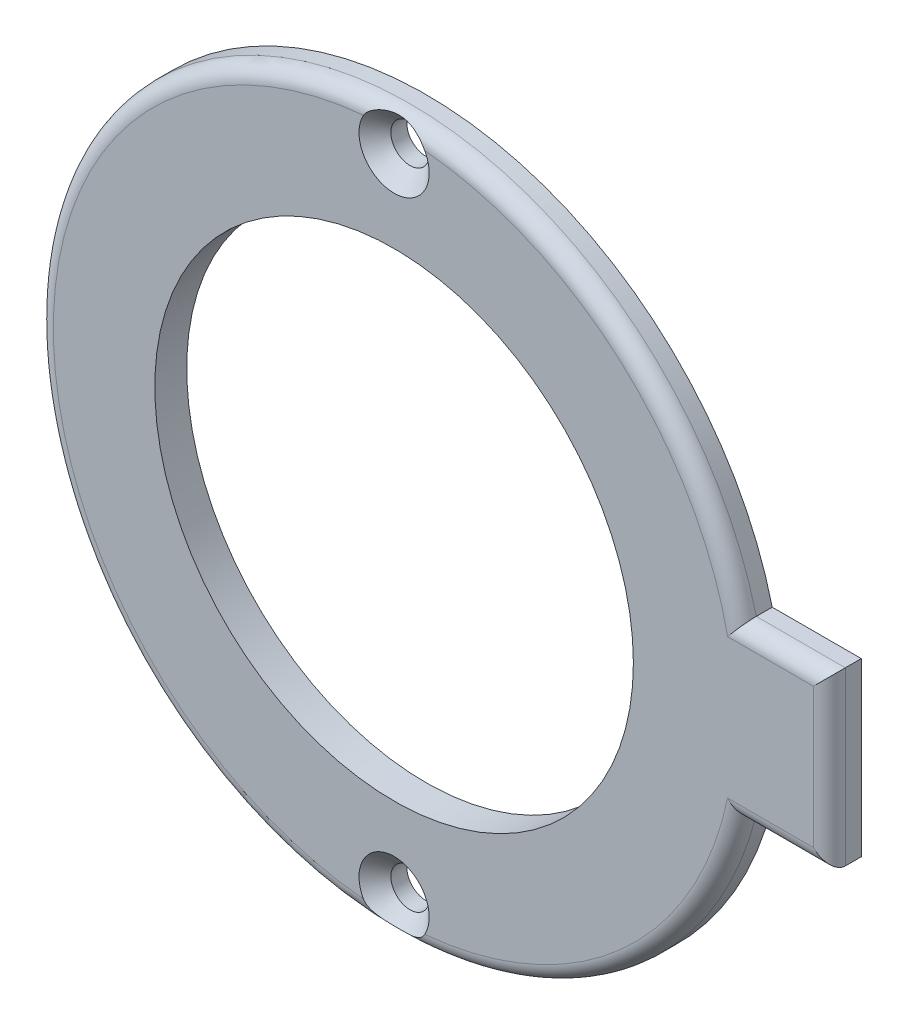
ISO-10303-21;
HEADER;
FILE_DESCRIPTION(('STEP AP214'),'2;1');
FILE_NAME('part.step','',(''),(''),'','','');
FILE_SCHEMA(('AUTOMOTIVE_DESIGN { 1 0 10303 214 1 1 1 1 }'));
ENDSEC;
DATA;
#1=APPLICATION_CONTEXT('core data for automotive mechanical design processes');
#2=APPLICATION_PROTOCOL_DEFINITION('international standard','automotive_design',2000,#1);
#3=PRODUCT_CONTEXT('',#1,'mechanical');
#4=PRODUCT('Part','Part','',(#3));
#5=PRODUCT_RELATED_PRODUCT_CATEGORY('part','',(#4));
#6=PRODUCT_DEFINITION_FORMATION('','',#4);
#7=PRODUCT_DEFINITION_CONTEXT('part definition',#1,'design');
#8=PRODUCT_DEFINITION('design','',#6,#7);
#9=PRODUCT_DEFINITION_SHAPE('','',#8);
#10=(LENGTH_UNIT() NAMED_UNIT(*) SI_UNIT(.MILLI.,.METRE.));
#11=(NAMED_UNIT(*) PLANE_ANGLE_UNIT() SI_UNIT($,.RADIAN.));
#12=(NAMED_UNIT(*) SI_UNIT($,.STERADIAN.) SOLID_ANGLE_UNIT());
#13=UNCERTAINTY_MEASURE_WITH_UNIT(LENGTH_MEASURE(1.E-05),#10,'distance_accuracy_value','');
#14=(GEOMETRIC_REPRESENTATION_CONTEXT(3) GLOBAL_UNCERTAINTY_ASSIGNED_CONTEXT((#13)) GLOBAL_UNIT_ASSIGNED_CONTEXT((#10,
#11,#12)) REPRESENTATION_CONTEXT('',''));
#15=CARTESIAN_POINT('',(0.,0.,0.));
#16=DIRECTION('',(0.,0.,1.));
#17=DIRECTION('',(1.,0.,0.));
#18=AXIS2_PLACEMENT_3D('',#15,#16,#17);
#19=CARTESIAN_POINT('',(0.,0.,2.));
#20=DIRECTION('',(0.,0.,-1.));
#21=DIRECTION('',(-1.,0.,0.));
#22=AXIS2_PLACEMENT_3D('',#19,#20,#21);
#23=PLANE('',#22);
#24=CARTESIAN_POINT('',(0.,0.,2.));
#25=DIRECTION('',(0.,0.,1.));
#26=DIRECTION('',(1.,0.,0.));
#27=AXIS2_PLACEMENT_3D('',#24,#25,#26);
#28=CIRCLE('',#27,15.);
#29=CARTESIAN_POINT('',(15.,0.,2.));
#30=VERTEX_POINT('',#29);
#31=EDGE_CURVE('E140',#30,#30,#28,.T.);
#32=ORIENTED_EDGE('',*,*,#31,.F.);
#33=EDGE_LOOP('',(#32));
#34=FACE_BOUND('',#33,.T.);
#35=CARTESIAN_POINT('',(0.,20.2,2.));
#36=DIRECTION('',(0.,0.,1.));
#37=DIRECTION('',(1.,0.,0.));
#38=AXIS2_PLACEMENT_3D('',#35,#36,#37);
#39=CIRCLE('',#38,2.2);
#40=CARTESIAN_POINT('',(-1.92030912127777,21.2735049504951,2.));
#41=VERTEX_POINT('',#40);
#42=CARTESIAN_POINT('',(1.92030912127777,21.2735049504951,2.));
#43=VERTEX_POINT('',#42);
#44=EDGE_CURVE('E375',#41,#43,#39,.T.);
#45=ORIENTED_EDGE('',*,*,#44,.F.);
#46=CARTESIAN_POINT('',(0.,0.,2.));
#47=DIRECTION('',(0.,0.,-1.));
#48=DIRECTION('',(-1.,0.,0.));
#49=AXIS2_PLACEMENT_3D('',#46,#47,#48);
#50=CIRCLE('',#49,21.36);
#51=CARTESIAN_POINT('',(-1.92030912127778,-21.273504950495,2.));
#52=VERTEX_POINT('',#51);
#53=EDGE_CURVE('E183',#41,#52,#50,.F.);
#54=ORIENTED_EDGE('',*,*,#53,.T.);
#55=CARTESIAN_POINT('',(0.,-20.2,2.));
#56=DIRECTION('',(0.,0.,1.));
#57=DIRECTION('',(1.,0.,0.));
#58=AXIS2_PLACEMENT_3D('',#55,#56,#57);
#59=CIRCLE('',#58,2.2);
#60=CARTESIAN_POINT('',(1.92030912127778,-21.273504950495,2.));
#61=VERTEX_POINT('',#60);
#62=EDGE_CURVE('E165',#61,#52,#59,.T.);
#63=ORIENTED_EDGE('',*,*,#62,.F.);
#64=CARTESIAN_POINT('',(0.,0.,2.));
#65=DIRECTION('',(0.,0.,-1.));
#66=DIRECTION('',(-1.,0.,0.));
#67=AXIS2_PLACEMENT_3D('',#64,#65,#66);
#68=CIRCLE('',#67,21.36);
#69=CARTESIAN_POINT('',(20.9061043716901,-4.38,2.));
#70=VERTEX_POINT('',#69);
#71=EDGE_CURVE('E119',#61,#70,#68,.F.);
#72=ORIENTED_EDGE('',*,*,#71,.T.);
#73=DIRECTION('',(1.,0.,0.));
#74=VECTOR('',#73,1.);
#75=CARTESIAN_POINT('',(0.,-4.38,2.));
#76=LINE('',#75,#74);
#77=CARTESIAN_POINT('',(26.283114983799,-4.38,2.));
#78=VERTEX_POINT('',#77);
#79=EDGE_CURVE('E169',#70,#78,#76,.T.);
#80=ORIENTED_EDGE('',*,*,#79,.T.);
#81=DIRECTION('',(0.,1.,0.));
#82=VECTOR('',#81,1.);
#83=CARTESIAN_POINT('',(26.283114983799,0.,2.));
#84=LINE('',#83,#82);
#85=CARTESIAN_POINT('',(26.283114983799,4.38,2.));
#86=VERTEX_POINT('',#85);
#87=EDGE_CURVE('E172',#78,#86,#84,.T.);
#88=ORIENTED_EDGE('',*,*,#87,.T.);
#89=DIRECTION('',(-1.,0.,0.));
#90=VECTOR('',#89,1.);
#91=CARTESIAN_POINT('',(0.,4.38,2.));
#92=LINE('',#91,#90);
#93=CARTESIAN_POINT('',(20.9061043716901,4.38,2.));
#94=VERTEX_POINT('',#93);
#95=EDGE_CURVE('E175',#86,#94,#92,.T.);
#96=ORIENTED_EDGE('',*,*,#95,.T.);
#97=CARTESIAN_POINT('',(0.,0.,2.));
#98=DIRECTION('',(0.,0.,-1.));
#99=DIRECTION('',(-1.,0.,0.));
#100=AXIS2_PLACEMENT_3D('',#97,#98,#99);
#101=CIRCLE('',#100,21.36);
#102=EDGE_CURVE('E179',#94,#43,#101,.F.);
#103=ORIENTED_EDGE('',*,*,#102,.T.);
#104=EDGE_LOOP('',(#45,#54,#63,#72,#80,#88,#96,#103));
#105=FACE_BOUND('',#104,.T.);
#106=ADVANCED_FACE('F39',(#34,#105),#23,.F.);
#107=CARTESIAN_POINT('',(0.,0.,2.));
#108=DIRECTION('',(0.,0.,-1.));
#109=DIRECTION('',(-1.,0.,0.));
#110=AXIS2_PLACEMENT_3D('',#107,#108,#109);
#111=CYLINDRICAL_SURFACE('',#110,22.36);
#112=CARTESIAN_POINT('',(0.,0.,1.));
#113=DIRECTION('',(0.,0.,-1.));
#114=DIRECTION('',(-1.,0.,0.));
#115=AXIS2_PLACEMENT_3D('',#112,#113,#114);
#116=CIRCLE('',#115,22.36);
#117=CARTESIAN_POINT('',(21.703114983799,-5.38,1.));
#118=VERTEX_POINT('',#117);
#119=CARTESIAN_POINT('',(21.703114983799,5.38,1.));
#120=VERTEX_POINT('',#119);
#121=EDGE_CURVE('E54',#118,#120,#116,.T.);
#122=ORIENTED_EDGE('',*,*,#121,.T.);
#123=DIRECTION('',(0.,0.,-1.));
#124=VECTOR('',#123,1.);
#125=CARTESIAN_POINT('',(21.703114983799,5.38,2.));
#126=LINE('',#125,#124);
#127=CARTESIAN_POINT('',(21.703114983799,5.38,0.));
#128=VERTEX_POINT('',#127);
#129=EDGE_CURVE('E133',#120,#128,#126,.T.);
#130=ORIENTED_EDGE('',*,*,#129,.T.);
#131=CARTESIAN_POINT('',(0.,0.,0.));
#132=DIRECTION('',(0.,0.,1.));
#133=DIRECTION('',(-1.,0.,0.));
#134=AXIS2_PLACEMENT_3D('',#131,#132,#133);
#135=CIRCLE('',#134,22.36);
#136=CARTESIAN_POINT('',(21.703114983799,-5.38,0.));
#137=VERTEX_POINT('',#136);
#138=EDGE_CURVE('E126',#128,#137,#135,.T.);
#139=ORIENTED_EDGE('',*,*,#138,.T.);
#140=DIRECTION('',(0.,0.,-1.));
#141=VECTOR('',#140,1.);
#142=CARTESIAN_POINT('',(21.703114983799,-5.38,2.));
#143=LINE('',#142,#141);
#144=EDGE_CURVE('E110',#118,#137,#143,.T.);
#145=ORIENTED_EDGE('',*,*,#144,.F.);
#146=EDGE_LOOP('',(#122,#130,#139,#145));
#147=FACE_BOUND('',#146,.T.);
#148=ADVANCED_FACE('F131',(#147),#111,.T.);
#149=CARTESIAN_POINT('',(21.703114983799,-5.38,2.));
#150=DIRECTION('',(0.,1.,0.));
#151=DIRECTION('',(-1.,0.,0.));
#152=AXIS2_PLACEMENT_3D('',#149,#150,#151);
#153=PLANE('',#152);
#154=DIRECTION('',(0.,0.,-1.));
#155=VECTOR('',#154,1.);
#156=CARTESIAN_POINT('',(27.283114983799,-5.38,2.));
#157=LINE('',#156,#155);
#158=CARTESIAN_POINT('',(27.283114983799,-5.38,1.));
#159=VERTEX_POINT('',#158);
#160=CARTESIAN_POINT('',(27.283114983799,-5.38,0.));
#161=VERTEX_POINT('',#160);
#162=EDGE_CURVE('E120',#159,#161,#157,.T.);
#163=ORIENTED_EDGE('',*,*,#162,.F.);
#164=DIRECTION('',(1.,0.,0.));
#165=VECTOR('',#164,1.);
#166=CARTESIAN_POINT('',(21.703114983799,-5.38,1.));
#167=LINE('',#166,#165);
#168=EDGE_CURVE('E62',#159,#118,#167,.F.);
#169=ORIENTED_EDGE('',*,*,#168,.T.);
#170=ORIENTED_EDGE('',*,*,#144,.T.);
#171=DIRECTION('',(1.,0.,0.));
#172=VECTOR('',#171,1.);
#173=CARTESIAN_POINT('',(21.703114983799,-5.38,0.));
#174=LINE('',#173,#172);
#175=EDGE_CURVE('E113',#137,#161,#174,.T.);
#176=ORIENTED_EDGE('',*,*,#175,.T.);
#177=EDGE_LOOP('',(#163,#169,#170,#176));
#178=FACE_BOUND('',#177,.T.);
#179=ADVANCED_FACE('F112',(#178),#153,.F.);
#180=CARTESIAN_POINT('',(27.283114983799,-5.38,2.));
#181=DIRECTION('',(-1.,0.,0.));
#182=DIRECTION('',(0.,0.,1.));
#183=AXIS2_PLACEMENT_3D('',#180,#181,#182);
#184=PLANE('',#183);
#185=DIRECTION('',(0.,0.,-1.));
#186=VECTOR('',#185,1.);
#187=CARTESIAN_POINT('',(27.283114983799,5.38,2.));
#188=LINE('',#187,#186);
#189=CARTESIAN_POINT('',(27.283114983799,5.38,1.));
#190=VERTEX_POINT('',#189);
#191=CARTESIAN_POINT('',(27.283114983799,5.38,0.));
#192=VERTEX_POINT('',#191);
#193=EDGE_CURVE('E151',#190,#192,#188,.T.);
#194=ORIENTED_EDGE('',*,*,#193,.F.);
#195=DIRECTION('',(0.,1.,0.));
#196=VECTOR('',#195,1.);
#197=CARTESIAN_POINT('',(27.283114983799,-5.38,1.));
#198=LINE('',#197,#196);
#199=EDGE_CURVE('E70',#190,#159,#198,.F.);
#200=ORIENTED_EDGE('',*,*,#199,.T.);
#201=ORIENTED_EDGE('',*,*,#162,.T.);
#202=DIRECTION('',(0.,1.,0.));
#203=VECTOR('',#202,1.);
#204=CARTESIAN_POINT('',(27.283114983799,-5.38,0.));
#205=LINE('',#204,#203);
#206=EDGE_CURVE('E128',#161,#192,#205,.T.);
#207=ORIENTED_EDGE('',*,*,#206,.T.);
#208=EDGE_LOOP('',(#194,#200,#201,#207));
#209=FACE_BOUND('',#208,.T.);
#210=ADVANCED_FACE('F268',(#209),#184,.F.);
#211=CARTESIAN_POINT('',(27.283114983799,5.38,2.));
#212=DIRECTION('',(0.,-1.,0.));
#213=DIRECTION('',(0.,0.,-1.));
#214=AXIS2_PLACEMENT_3D('',#211,#212,#213);
#215=PLANE('',#214);
#216=ORIENTED_EDGE('',*,*,#129,.F.);
#217=DIRECTION('',(-1.,0.,0.));
#218=VECTOR('',#217,1.);
#219=CARTESIAN_POINT('',(27.283114983799,5.38,1.));
#220=LINE('',#219,#218);
#221=EDGE_CURVE('E187',#120,#190,#220,.F.);
#222=ORIENTED_EDGE('',*,*,#221,.T.);
#223=ORIENTED_EDGE('',*,*,#193,.T.);
#224=DIRECTION('',(-1.,0.,0.));
#225=VECTOR('',#224,1.);
#226=CARTESIAN_POINT('',(27.283114983799,5.38,0.));
#227=LINE('',#226,#225);
#228=EDGE_CURVE('E146',#192,#128,#227,.T.);
#229=ORIENTED_EDGE('',*,*,#228,.T.);
#230=EDGE_LOOP('',(#216,#222,#223,#229));
#231=FACE_BOUND('',#230,.T.);
#232=ADVANCED_FACE('F264',(#231),#215,.F.);
#233=CARTESIAN_POINT('',(0.,0.,0.));
#234=DIRECTION('',(0.,0.,-1.));
#235=DIRECTION('',(-1.,0.,0.));
#236=AXIS2_PLACEMENT_3D('',#233,#234,#235);
#237=PLANE('',#236);
#238=CARTESIAN_POINT('',(0.,20.2,0.));
#239=DIRECTION('',(0.,0.,-1.));
#240=DIRECTION('',(-1.,0.,0.));
#241=AXIS2_PLACEMENT_3D('',#238,#239,#240);
#242=CIRCLE('',#241,1.19999999999999);
#243=CARTESIAN_POINT('',(-1.19999999999999,20.2,0.));
#244=VERTEX_POINT('',#243);
#245=EDGE_CURVE('E161',#244,#244,#242,.T.);
#246=ORIENTED_EDGE('',*,*,#245,.F.);
#247=EDGE_LOOP('',(#246));
#248=FACE_BOUND('',#247,.T.);
#249=CARTESIAN_POINT('',(0.,-20.2,0.));
#250=DIRECTION('',(0.,0.,-1.));
#251=DIRECTION('',(-1.,0.,0.));
#252=AXIS2_PLACEMENT_3D('',#249,#250,#251);
#253=CIRCLE('',#252,1.19999999999999);
#254=CARTESIAN_POINT('',(-1.19999999999999,-20.2,0.));
#255=VERTEX_POINT('',#254);
#256=EDGE_CURVE('E156',#255,#255,#253,.T.);
#257=ORIENTED_EDGE('',*,*,#256,.F.);
#258=EDGE_LOOP('',(#257));
#259=FACE_BOUND('',#258,.T.);
#260=CARTESIAN_POINT('',(0.,0.,0.));
#261=DIRECTION('',(0.,0.,1.));
#262=DIRECTION('',(1.,0.,0.));
#263=AXIS2_PLACEMENT_3D('',#260,#261,#262);
#264=CIRCLE('',#263,15.);
#265=CARTESIAN_POINT('',(15.,0.,0.));
#266=VERTEX_POINT('',#265);
#267=EDGE_CURVE('E136',#266,#266,#264,.T.);
#268=ORIENTED_EDGE('',*,*,#267,.T.);
#269=EDGE_LOOP('',(#268));
#270=FACE_BOUND('',#269,.T.);
#271=ORIENTED_EDGE('',*,*,#138,.F.);
#272=ORIENTED_EDGE('',*,*,#228,.F.);
#273=ORIENTED_EDGE('',*,*,#206,.F.);
#274=ORIENTED_EDGE('',*,*,#175,.F.);
#275=EDGE_LOOP('',(#271,#272,#273,#274));
#276=FACE_BOUND('',#275,.T.);
#277=ADVANCED_FACE('F124',(#248,#259,#270,#276),#237,.T.);
#278=CARTESIAN_POINT('',(0.,0.,0.));
#279=DIRECTION('',(0.,0.,1.));
#280=DIRECTION('',(1.,0.,0.));
#281=AXIS2_PLACEMENT_3D('',#278,#279,#280);
#282=CYLINDRICAL_SURFACE('',#281,15.);
#283=ORIENTED_EDGE('',*,*,#267,.F.);
#284=EDGE_LOOP('',(#283));
#285=FACE_BOUND('',#284,.T.);
#286=ORIENTED_EDGE('',*,*,#31,.T.);
#287=EDGE_LOOP('',(#286));
#288=FACE_BOUND('',#287,.T.);
#289=ADVANCED_FACE('F217',(#285,#288),#282,.F.);
#290=CARTESIAN_POINT('',(0.,-20.2,2.));
#291=DIRECTION('',(0.,0.,1.));
#292=DIRECTION('',(1.,0.,0.));
#293=AXIS2_PLACEMENT_3D('',#290,#291,#292);
#294=CONICAL_SURFACE('',#293,2.2,0.785398163397448);
#295=CARTESIAN_POINT('',(0.,-20.2,0.999999999999992));
#296=DIRECTION('',(0.,0.,1.));
#297=DIRECTION('',(1.,0.,0.));
#298=AXIS2_PLACEMENT_3D('',#295,#296,#297);
#299=CIRCLE('',#298,1.19999999999999);
#300=CARTESIAN_POINT('',(1.19999999999999,-20.2,0.999999999999992));
#301=VERTEX_POINT('',#300);
#302=EDGE_CURVE('E160',#301,#301,#299,.T.);
#303=ORIENTED_EDGE('',*,*,#302,.F.);
#304=EDGE_LOOP('',(#303));
#305=FACE_BOUND('',#304,.T.);
#306=ORIENTED_EDGE('',*,*,#62,.T.);
#307=CARTESIAN_POINT('',(-1.92030912127778,-21.273504950495,2.));
#308=CARTESIAN_POINT('',(-1.90493083621762,-21.301000961347,1.99998955127298));
#309=CARTESIAN_POINT('',(-1.88811931532898,-21.3276235801376,1.99898632784751));
#310=CARTESIAN_POINT('',(-1.85217769926314,-21.3790116365199,1.99537229781815));
#311=CARTESIAN_POINT('',(-1.83305585566123,-21.4037832005088,1.99276708405843));
#312=CARTESIAN_POINT('',(-1.79322123703443,-21.4512008298106,1.98636890424802));
#313=CARTESIAN_POINT('',(-1.77253580155552,-21.4738726705308,1.98259385583624));
#314=CARTESIAN_POINT('',(-1.72964674682627,-21.517582403581,1.97411614171407));
#315=CARTESIAN_POINT('',(-1.70744149282421,-21.5386184828192,1.96941246657249));
#316=CARTESIAN_POINT('',(-1.65009267478468,-21.5895015907636,1.95672169271822));
#317=CARTESIAN_POINT('',(-1.61415095117619,-21.6183384858234,1.94828734790497));
#318=CARTESIAN_POINT('',(-1.54011212183152,-21.6727194113867,1.93044976695062));
#319=CARTESIAN_POINT('',(-1.50201453137185,-21.6982626970911,1.92104631252221));
#320=CARTESIAN_POINT('',(-1.38446348502388,-21.7708481367513,1.89192403956547));
#321=CARTESIAN_POINT('',(-1.30235997373218,-21.81333133588,1.87144159006643));
#322=CARTESIAN_POINT('',(-1.15172451245552,-21.8799492484083,1.83560767580781));
#323=CARTESIAN_POINT('',(-1.08406770125268,-21.9060650917084,1.8200994767109));
#324=CARTESIAN_POINT('',(-0.946455544392773,-21.9526050227006,1.79056426063645));
#325=CARTESIAN_POINT('',(-0.876498909488873,-21.9730258548666,1.77653809368918));
#326=CARTESIAN_POINT('',(-0.735102159474194,-22.0085397985118,1.75091279290247));
#327=CARTESIAN_POINT('',(-0.663668392182494,-22.0236520870211,1.73930498595131));
#328=CARTESIAN_POINT('',(-0.519541504249109,-22.0489584250482,1.71919907991505));
#329=CARTESIAN_POINT('',(-0.446849137130662,-22.0591553186577,1.71069918325432));
#330=CARTESIAN_POINT('',(-0.31185666153473,-22.0736354726005,1.69839984429155));
#331=CARTESIAN_POINT('',(-0.249674523360912,-22.0785863040158,1.69407909122203));
#332=CARTESIAN_POINT('',(-0.124996445570486,-22.0851805804113,1.68829046967917));
#333=CARTESIAN_POINT('',(-0.0625004775252885,-22.0868237201382,1.68682286451164));
#334=CARTESIAN_POINT('',(0.0755977399311141,-22.086824077522,1.68682511244896));
#335=CARTESIAN_POINT('',(0.151202077332273,-22.0844205596951,1.68897497057496));
#336=CARTESIAN_POINT('',(0.301898628670744,-22.0747581938193,1.69741184874545));
#337=CARTESIAN_POINT('',(0.376990562986225,-22.0674968802754,1.70370096957885));
#338=CARTESIAN_POINT('',(0.526282754782242,-22.0479503721261,1.71996885729914));
#339=CARTESIAN_POINT('',(0.60048076274929,-22.0356544702316,1.72995548347825));
#340=CARTESIAN_POINT('',(0.747290314755779,-22.0057889716234,1.75290392939448));
#341=CARTESIAN_POINT('',(0.819902358228506,-21.988221061564,1.76586479728169));
#342=CARTESIAN_POINT('',(1.00106570420297,-21.9366194978003,1.80136692756403));
#343=CARTESIAN_POINT('',(1.10831845473277,-21.8987911999233,1.82535018688357));
#344=CARTESIAN_POINT('',(1.26380919064676,-21.8305423840893,1.86223979514526));
#345=CARTESIAN_POINT('',(1.31473224439575,-21.8058808051051,1.87468634274728));
#346=CARTESIAN_POINT('',(1.41435234329217,-21.7523038978097,1.8992845844427));
#347=CARTESIAN_POINT('',(1.46305081045315,-21.7233913381541,1.91143646449646));
#348=CARTESIAN_POINT('',(1.56382785694378,-21.6566913031278,1.93624910122438));
#349=CARTESIAN_POINT('',(1.61550619507882,-21.6182363891023,1.94876589523737));
#350=CARTESIAN_POINT('',(1.71345621832591,-21.5345567534987,1.97094018124583));
#351=CARTESIAN_POINT('',(1.75975619707289,-21.4893706080608,1.98061308845905));
#352=CARTESIAN_POINT('',(1.82432720532904,-21.4147536106435,1.9914974028292));
#353=CARTESIAN_POINT('',(1.84544552832428,-21.3880681657887,1.99454464766447));
#354=CARTESIAN_POINT('',(1.88505353226893,-21.3324506639986,1.99879471757939));
#355=CARTESIAN_POINT('',(1.90352687935958,-21.3035062207736,1.99998649588108));
#356=CARTESIAN_POINT('',(1.92030912127778,-21.273504950495,2.));
#357=B_SPLINE_CURVE_WITH_KNOTS('',3,(#307,#308,#309,#310,#311,#312,#313,#314,#315,#316,#317,
#318,#319,#320,#321,#322,#323,#324,#325,#326,#327,#328,#329,#330,#331,#332,#333,#334,#335,#336,
#337,#338,#339,#340,#341,#342,#343,#344,#345,#346,#347,#348,#349,#350,#351,#352,#353,#354,#355,
#356),.UNSPECIFIED.,.F.,.F.,(4,2,2,2,2,2,2,2,2,2,2,2,2,2,2,2,2,2,2,2,2,2,2,2,4),(0.,
0.0943630793260332,0.188398575527203,0.281059581491968,0.373821871514774,0.514128381904102,
0.654466565024793,0.937547867257682,1.15979549132388,1.38216990297705,1.60373252324131,
1.82516679104258,2.01260372696968,2.20005795989461,2.42679408913312,2.65364538198129,
2.88098165668355,3.1082452779167,3.4556790434527,3.62933021975049,3.80286879429332,
3.99927584781442,4.19459777711933,4.29689754869099,4.3998040782776),.UNSPECIFIED.);
#358=EDGE_CURVE('E11',#52,#61,#357,.T.);
#359=ORIENTED_EDGE('',*,*,#358,.T.);
#360=EDGE_LOOP('',(#306,#359));
#361=FACE_BOUND('',#360,.T.);
#362=ADVANCED_FACE('F213',(#305,#361),#294,.F.);
#363=CARTESIAN_POINT('',(0.,-20.2,2.));
#364=DIRECTION('',(0.,0.,1.));
#365=DIRECTION('',(1.,0.,0.));
#366=AXIS2_PLACEMENT_3D('',#363,#364,#365);
#367=CYLINDRICAL_SURFACE('',#366,1.19999999999999);
#368=ORIENTED_EDGE('',*,*,#256,.T.);
#369=EDGE_LOOP('',(#368));
#370=FACE_BOUND('',#369,.T.);
#371=ORIENTED_EDGE('',*,*,#302,.T.);
#372=EDGE_LOOP('',(#371));
#373=FACE_BOUND('',#372,.T.);
#374=ADVANCED_FACE('F208',(#370,#373),#367,.F.);
#375=CARTESIAN_POINT('',(0.,20.2,2.));
#376=DIRECTION('',(0.,0.,1.));
#377=DIRECTION('',(1.,0.,0.));
#378=AXIS2_PLACEMENT_3D('',#375,#376,#377);
#379=CONICAL_SURFACE('',#378,2.2,0.785398163397448);
#380=CARTESIAN_POINT('',(0.,20.2,0.999999999999992));
#381=DIRECTION('',(0.,0.,1.));
#382=DIRECTION('',(1.,0.,0.));
#383=AXIS2_PLACEMENT_3D('',#380,#381,#382);
#384=CIRCLE('',#383,1.19999999999999);
#385=CARTESIAN_POINT('',(1.19999999999999,20.2,0.999999999999992));
#386=VERTEX_POINT('',#385);
#387=EDGE_CURVE('E166',#386,#386,#384,.T.);
#388=ORIENTED_EDGE('',*,*,#387,.F.);
#389=EDGE_LOOP('',(#388));
#390=FACE_BOUND('',#389,.T.);
#391=ORIENTED_EDGE('',*,*,#44,.T.);
#392=CARTESIAN_POINT('',(1.92030912127777,21.273504950495,2.));
#393=CARTESIAN_POINT('',(1.90493083621761,21.301000961347,1.99998955127298));
#394=CARTESIAN_POINT('',(1.88811931532897,21.3276235801376,1.99898632784751));
#395=CARTESIAN_POINT('',(1.85217769926313,21.3790116365199,1.99537229781815));
#396=CARTESIAN_POINT('',(1.83305585566122,21.4037832005088,1.99276708405843));
#397=CARTESIAN_POINT('',(1.79322123703442,21.4512008298106,1.98636890424802));
#398=CARTESIAN_POINT('',(1.77253580155551,21.4738726705308,1.98259385583623));
#399=CARTESIAN_POINT('',(1.72964674682626,21.517582403581,1.97411614171407));
#400=CARTESIAN_POINT('',(1.7074414928242,21.5386184828192,1.96941246657249));
#401=CARTESIAN_POINT('',(1.65009267478467,21.5895015907636,1.95672169271822));
#402=CARTESIAN_POINT('',(1.61415095117618,21.6183384858234,1.94828734790497));
#403=CARTESIAN_POINT('',(1.54011212183152,21.6727194113868,1.93044976695062));
#404=CARTESIAN_POINT('',(1.50201453137184,21.6982626970911,1.92104631252221));
#405=CARTESIAN_POINT('',(1.38446348502387,21.7708481367513,1.89192403956547));
#406=CARTESIAN_POINT('',(1.30235997373217,21.81333133588,1.87144159006642));
#407=CARTESIAN_POINT('',(1.15172451245551,21.8799492484083,1.83560767580781));
#408=CARTESIAN_POINT('',(1.08406770125267,21.9060650917085,1.8200994767109));
#409=CARTESIAN_POINT('',(0.946455544392759,21.9526050227006,1.79056426063645));
#410=CARTESIAN_POINT('',(0.876498909488858,21.9730258548666,1.77653809368918));
#411=CARTESIAN_POINT('',(0.735102159474178,22.0085397985118,1.75091279290247));
#412=CARTESIAN_POINT('',(0.663668392182478,22.0236520870211,1.73930498595132));
#413=CARTESIAN_POINT('',(0.519541504249092,22.0489584250482,1.71919907991505));
#414=CARTESIAN_POINT('',(0.446849137130646,22.0591553186577,1.71069918325433));
#415=CARTESIAN_POINT('',(0.311856661534717,22.0736354726005,1.69839984429155));
#416=CARTESIAN_POINT('',(0.249674523360903,22.0785863040158,1.69407909122203));
#417=CARTESIAN_POINT('',(0.124996445570485,22.0851805804113,1.68829046967917));
#418=CARTESIAN_POINT('',(0.0625004775252915,22.0868237201382,1.68682286451164));
#419=CARTESIAN_POINT('',(-0.0755977399311072,22.086824077522,1.68682511244896));
#420=CARTESIAN_POINT('',(-0.151202077332267,22.0844205596951,1.68897497057497));
#421=CARTESIAN_POINT('',(-0.301898628670738,22.0747581938193,1.69741184874545));
#422=CARTESIAN_POINT('',(-0.376990562986219,22.0674968802754,1.70370096957885));
#423=CARTESIAN_POINT('',(-0.526282754782236,22.0479503721261,1.71996885729914));
#424=CARTESIAN_POINT('',(-0.600480762749283,22.0356544702316,1.72995548347825));
#425=CARTESIAN_POINT('',(-0.747290314755773,22.0057889716234,1.75290392939448));
#426=CARTESIAN_POINT('',(-0.8199023582285,21.988221061564,1.76586479728169));
#427=CARTESIAN_POINT('',(-1.00106570420297,21.9366194978003,1.80136692756404));
#428=CARTESIAN_POINT('',(-1.10831845473276,21.8987911999233,1.82535018688357));
#429=CARTESIAN_POINT('',(-1.26380919064675,21.8305423840894,1.86223979514526));
#430=CARTESIAN_POINT('',(-1.31473224439575,21.8058808051051,1.87468634274728));
#431=CARTESIAN_POINT('',(-1.41435234329217,21.7523038978097,1.8992845844427));
#432=CARTESIAN_POINT('',(-1.46305081045314,21.7233913381541,1.91143646449646));
#433=CARTESIAN_POINT('',(-1.56382785694378,21.6566913031278,1.93624910122439));
#434=CARTESIAN_POINT('',(-1.61550619507882,21.6182363891023,1.94876589523737));
#435=CARTESIAN_POINT('',(-1.71345621832591,21.5345567534987,1.97094018124583));
#436=CARTESIAN_POINT('',(-1.75975619707288,21.4893706080608,1.98061308845905));
#437=CARTESIAN_POINT('',(-1.82432720532903,21.4147536106435,1.9914974028292));
#438=CARTESIAN_POINT('',(-1.84544552832428,21.3880681657887,1.99454464766447));
#439=CARTESIAN_POINT('',(-1.88505353226892,21.3324506639986,1.99879471757939));
#440=CARTESIAN_POINT('',(-1.90352687935958,21.3035062207736,1.99998649588108));
#441=CARTESIAN_POINT('',(-1.92030912127777,21.2735049504951,2.));
#442=B_SPLINE_CURVE_WITH_KNOTS('',3,(#392,#393,#394,#395,#396,#397,#398,#399,#400,#401,#402,
#403,#404,#405,#406,#407,#408,#409,#410,#411,#412,#413,#414,#415,#416,#417,#418,#419,#420,#421,
#422,#423,#424,#425,#426,#427,#428,#429,#430,#431,#432,#433,#434,#435,#436,#437,#438,#439,#440,
#441),.UNSPECIFIED.,.F.,.F.,(4,2,2,2,2,2,2,2,2,2,2,2,2,2,2,2,2,2,2,2,2,2,2,2,4),(0.,
0.0943630793260376,0.188398575527208,0.28105958149197,0.373821871514776,0.514128381904101,
0.654466565024792,0.937547867257683,1.15979549132389,1.38216990297705,1.60373252324132,
1.82516679104258,2.01260372696968,2.20005795989459,2.42679408913311,2.65364538198128,
2.88098165668353,3.10824527791668,3.45567904345268,3.62933021975048,3.8028687942933,
3.9992758478144,4.19459777711932,4.29689754869097,4.39980407827758),.UNSPECIFIED.);
#443=EDGE_CURVE('E195',#43,#41,#442,.T.);
#444=ORIENTED_EDGE('',*,*,#443,.T.);
#445=EDGE_LOOP('',(#391,#444));
#446=FACE_BOUND('',#445,.T.);
#447=ADVANCED_FACE('F203',(#390,#446),#379,.F.);
#448=CARTESIAN_POINT('',(0.,20.2,2.));
#449=DIRECTION('',(0.,0.,1.));
#450=DIRECTION('',(1.,0.,0.));
#451=AXIS2_PLACEMENT_3D('',#448,#449,#450);
#452=CYLINDRICAL_SURFACE('',#451,1.19999999999999);
#453=ORIENTED_EDGE('',*,*,#245,.T.);
#454=EDGE_LOOP('',(#453));
#455=FACE_BOUND('',#454,.T.);
#456=ORIENTED_EDGE('',*,*,#387,.T.);
#457=EDGE_LOOP('',(#456));
#458=FACE_BOUND('',#457,.T.);
#459=ADVANCED_FACE('F207',(#455,#458),#452,.F.);
#460=CARTESIAN_POINT('',(0.,0.,1.));
#461=DIRECTION('',(0.,0.,-1.));
#462=DIRECTION('',(-1.,0.,0.));
#463=AXIS2_PLACEMENT_3D('',#460,#461,#462);
#464=TOROIDAL_SURFACE('',#463,21.36,1.);
#465=ORIENTED_EDGE('',*,*,#358,.F.);
#466=ORIENTED_EDGE('',*,*,#53,.F.);
#467=ORIENTED_EDGE('',*,*,#443,.F.);
#468=ORIENTED_EDGE('',*,*,#102,.F.);
#469=CARTESIAN_POINT('',(21.703114983799,5.38,1.));
#470=CARTESIAN_POINT('',(21.7031166720455,5.380002289249,1.023893679522));
#471=CARTESIAN_POINT('',(21.7024444379038,5.37914292476834,1.04777395327568));
#472=CARTESIAN_POINT('',(21.6997748761024,5.37573106491876,1.09532659130421));
#473=CARTESIAN_POINT('',(21.6977782314052,5.37317944220149,1.11899905636871));
#474=CARTESIAN_POINT('',(21.6898713236129,5.3630768259323,1.18914564700521));
#475=CARTESIAN_POINT('',(21.6820433669906,5.35307713589702,1.23508374907802));
#476=CARTESIAN_POINT('',(21.6617512322089,5.32717802091934,1.32404067219352));
#477=CARTESIAN_POINT('',(21.6492947321389,5.31128836668722,1.36706418914622));
#478=CARTESIAN_POINT('',(21.6203709491485,5.27443554568487,1.44947252427765));
#479=CARTESIAN_POINT('',(21.6038984922444,5.25346583421247,1.48885255733238));
#480=CARTESIAN_POINT('',(21.566316697598,5.20569020269473,1.56607820938929));
#481=CARTESIAN_POINT('',(21.5449583461329,5.17857209677456,1.60360744448331));
#482=CARTESIAN_POINT('',(21.4991966075749,5.12056918228407,1.6735159350456));
#483=CARTESIAN_POINT('',(21.4747917354841,5.08968253694163,1.70589266134289));
#484=CARTESIAN_POINT('',(21.4114610017094,5.00968336626703,1.77954711658901));
#485=CARTESIAN_POINT('',(21.371131043693,4.95886569723402,1.81778062405089));
#486=CARTESIAN_POINT('',(21.2869541497825,4.85312830077887,1.88319223594675));
#487=CARTESIAN_POINT('',(21.2431000052611,4.79820018217724,1.91034695264763));
#488=CARTESIAN_POINT('',(21.1516924053278,4.68408517127312,1.95467530744162));
#489=CARTESIAN_POINT('',(21.1040640029724,4.62481707636232,1.97148038594892));
#490=CARTESIAN_POINT('',(21.0076830701985,4.50530132069554,1.99397437273306));
#491=CARTESIAN_POINT('',(20.958933467079,4.44505631029707,1.99968949589251));
#492=CARTESIAN_POINT('',(20.9087911770697,4.3833082049135,1.99999589548035));
#493=CARTESIAN_POINT('',(20.9074477871598,4.38165403777496,1.99999999917794));
#494=CARTESIAN_POINT('',(20.9061043716901,4.38,2.));
#495=B_SPLINE_CURVE_WITH_KNOTS('',3,(#469,#470,#471,#472,#473,#474,#475,#476,#477,#478,#479,
#480,#481,#482,#483,#484,#485,#486,#487,#488,#489,#490,#491,#492,#493,#494),.UNSPECIFIED.,.F.,
.F.,(4,2,2,2,2,2,2,2,2,2,2,2,4),(0.,0.0716303865335585,0.143223863911354,0.285421054161541,
0.427383405167143,0.569529629881208,0.72194505871342,0.874435073257196,1.09912848849688,
1.32429381554055,1.55707309358324,1.78930144505625,1.79569430027295),.UNSPECIFIED.);
#496=EDGE_CURVE('E225',#120,#94,#495,.T.);
#497=ORIENTED_EDGE('',*,*,#496,.F.);
#498=ORIENTED_EDGE('',*,*,#121,.F.);
#499=CARTESIAN_POINT('',(21.703114983799,-5.38,1.));
#500=CARTESIAN_POINT('',(21.7031166720455,-5.38000228924901,1.023893679522));
#501=CARTESIAN_POINT('',(21.7024444379038,-5.37914292476835,1.04777395327568));
#502=CARTESIAN_POINT('',(21.6997748761024,-5.37573106491876,1.0953265913042));
#503=CARTESIAN_POINT('',(21.6977782314052,-5.37317944220149,1.11899905636871));
#504=CARTESIAN_POINT('',(21.6898713236129,-5.3630768259323,1.18914564700521));
#505=CARTESIAN_POINT('',(21.6820433669906,-5.35307713589703,1.23508374907802));
#506=CARTESIAN_POINT('',(21.6617512322089,-5.32717802091934,1.32404067219352));
#507=CARTESIAN_POINT('',(21.6492947321389,-5.31128836668722,1.36706418914622));
#508=CARTESIAN_POINT('',(21.6203709491485,-5.27443554568488,1.44947252427765));
#509=CARTESIAN_POINT('',(21.6038984922444,-5.25346583421247,1.48885255733238));
#510=CARTESIAN_POINT('',(21.566316697598,-5.20569020269473,1.56607820938929));
#511=CARTESIAN_POINT('',(21.5449583461329,-5.17857209677456,1.60360744448331));
#512=CARTESIAN_POINT('',(21.4991966075749,-5.12056918228408,1.6735159350456));
#513=CARTESIAN_POINT('',(21.4747917354841,-5.08968253694163,1.70589266134289));
#514=CARTESIAN_POINT('',(21.4114610017094,-5.00968336626704,1.77954711658901));
#515=CARTESIAN_POINT('',(21.371131043693,-4.95886569723402,1.81778062405089));
#516=CARTESIAN_POINT('',(21.2869541497825,-4.85312830077887,1.88319223594675));
#517=CARTESIAN_POINT('',(21.2431000052611,-4.79820018217724,1.91034695264763));
#518=CARTESIAN_POINT('',(21.1516924053278,-4.68408517127312,1.95467530744162));
#519=CARTESIAN_POINT('',(21.1040640029724,-4.62481707636233,1.97148038594892));
#520=CARTESIAN_POINT('',(21.0076830701985,-4.50530132069554,1.99397437273306));
#521=CARTESIAN_POINT('',(20.958933467079,-4.44505631029708,1.99968949589251));
#522=CARTESIAN_POINT('',(20.9087911770697,-4.3833082049135,1.99999589548035));
#523=CARTESIAN_POINT('',(20.9074477871598,-4.38165403777496,1.99999999917794));
#524=CARTESIAN_POINT('',(20.9061043716901,-4.38,2.));
#525=B_SPLINE_CURVE_WITH_KNOTS('',3,(#499,#500,#501,#502,#503,#504,#505,#506,#507,#508,#509,
#510,#511,#512,#513,#514,#515,#516,#517,#518,#519,#520,#521,#522,#523,#524),.UNSPECIFIED.,.F.,
.F.,(4,2,2,2,2,2,2,2,2,2,2,2,4),(0.,0.0716303865335576,0.143223863911353,0.285421054161541,
0.427383405167144,0.569529629881209,0.72194505871342,0.874435073257196,1.09912848849689,
1.32429381554056,1.55707309358324,1.78930144505625,1.79569430027295),.UNSPECIFIED.);
#526=EDGE_CURVE('E44',#70,#118,#525,.F.);
#527=ORIENTED_EDGE('',*,*,#526,.F.);
#528=ORIENTED_EDGE('',*,*,#71,.F.);
#529=EDGE_LOOP('',(#465,#466,#467,#468,#497,#498,#527,#528));
#530=FACE_BOUND('',#529,.T.);
#531=ADVANCED_FACE('F41',(#530),#464,.T.);
#532=CARTESIAN_POINT('',(0.,-4.38,1.));
#533=DIRECTION('',(1.,0.,0.));
#534=DIRECTION('',(0.,1.,0.));
#535=AXIS2_PLACEMENT_3D('',#532,#533,#534);
#536=CYLINDRICAL_SURFACE('',#535,1.);
#537=ORIENTED_EDGE('',*,*,#526,.T.);
#538=ORIENTED_EDGE('',*,*,#168,.F.);
#539=CARTESIAN_POINT('',(26.283114983799,-4.38,1.));
#540=DIRECTION('',(0.707106781186548,0.707106781186547,0.));
#541=DIRECTION('',(-0.707106781186547,0.707106781186548,0.));
#542=AXIS2_PLACEMENT_3D('',#539,#540,#541);
#543=ELLIPSE('',#542,1.4142135623731,1.);
#544=EDGE_CURVE('E381',#78,#159,#543,.T.);
#545=ORIENTED_EDGE('',*,*,#544,.F.);
#546=ORIENTED_EDGE('',*,*,#79,.F.);
#547=EDGE_LOOP('',(#537,#538,#545,#546));
#548=FACE_BOUND('',#547,.T.);
#549=ADVANCED_FACE('F243',(#548),#536,.T.);
#550=CARTESIAN_POINT('',(26.283114983799,0.,1.));
#551=DIRECTION('',(0.,1.,0.));
#552=DIRECTION('',(0.,0.,1.));
#553=AXIS2_PLACEMENT_3D('',#550,#551,#552);
#554=CYLINDRICAL_SURFACE('',#553,1.);
#555=ORIENTED_EDGE('',*,*,#544,.T.);
#556=ORIENTED_EDGE('',*,*,#199,.F.);
#557=CARTESIAN_POINT('',(26.283114983799,4.38,1.));
#558=DIRECTION('',(-0.707106781186547,0.707106781186547,0.));
#559=DIRECTION('',(0.707106781186547,0.707106781186547,0.));
#560=AXIS2_PLACEMENT_3D('',#557,#558,#559);
#561=ELLIPSE('',#560,1.41421356237309,1.);
#562=EDGE_CURVE('E233',#86,#190,#561,.T.);
#563=ORIENTED_EDGE('',*,*,#562,.F.);
#564=ORIENTED_EDGE('',*,*,#87,.F.);
#565=EDGE_LOOP('',(#555,#556,#563,#564));
#566=FACE_BOUND('',#565,.T.);
#567=ADVANCED_FACE('F239',(#566),#554,.T.);
#568=CARTESIAN_POINT('',(0.,4.38,1.));
#569=DIRECTION('',(-1.,0.,0.));
#570=DIRECTION('',(0.,0.,1.));
#571=AXIS2_PLACEMENT_3D('',#568,#569,#570);
#572=CYLINDRICAL_SURFACE('',#571,1.);
#573=ORIENTED_EDGE('',*,*,#562,.T.);
#574=ORIENTED_EDGE('',*,*,#221,.F.);
#575=ORIENTED_EDGE('',*,*,#496,.T.);
#576=ORIENTED_EDGE('',*,*,#95,.F.);
#577=EDGE_LOOP('',(#573,#574,#575,#576));
#578=FACE_BOUND('',#577,.T.);
#579=ADVANCED_FACE('F234',(#578),#572,.T.);
#580=CLOSED_SHELL('',(#106,#148,#179,#210,#232,#277,#289,#362,#374,#447,#459,#531,#549,#567,#579));
#581=MANIFOLD_SOLID_BREP('B2',#580);
#582=ADVANCED_BREP_SHAPE_REPRESENTATION('',(#18,#581),#14);
#583=SHAPE_DEFINITION_REPRESENTATION(#9,#582);
ENDSEC;
END-ISO-10303-21;
